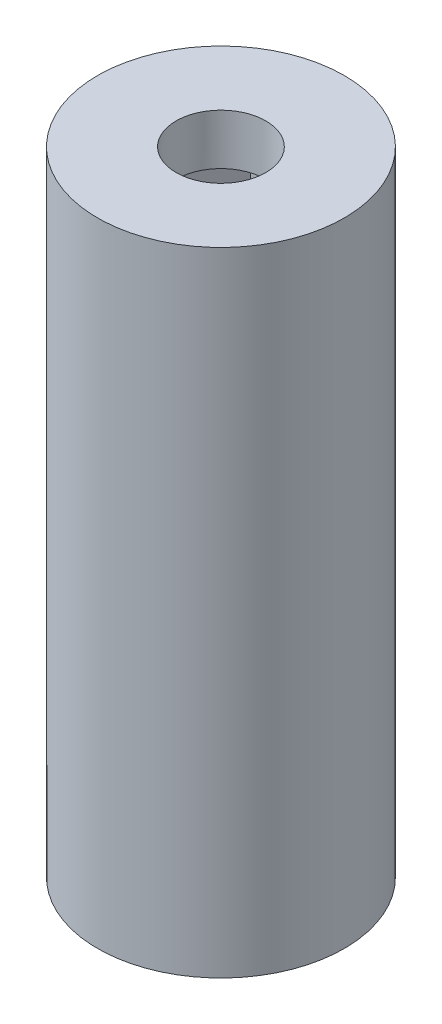
ISO-10303-21;
HEADER;
FILE_DESCRIPTION(('STEP AP214'),'2;1');
FILE_NAME('part.step','',(''),(''),'','','');
FILE_SCHEMA(('AUTOMOTIVE_DESIGN { 1 0 10303 214 1 1 1 1 }'));
ENDSEC;
DATA;
#1=APPLICATION_CONTEXT('core data for automotive mechanical design processes');
#2=APPLICATION_PROTOCOL_DEFINITION('international standard','automotive_design',2000,#1);
#3=PRODUCT_CONTEXT('',#1,'mechanical');
#4=PRODUCT('Part','Part','',(#3));
#5=PRODUCT_RELATED_PRODUCT_CATEGORY('part','',(#4));
#6=PRODUCT_DEFINITION_FORMATION('','',#4);
#7=PRODUCT_DEFINITION_CONTEXT('part definition',#1,'design');
#8=PRODUCT_DEFINITION('design','',#6,#7);
#9=PRODUCT_DEFINITION_SHAPE('','',#8);
#10=(LENGTH_UNIT() NAMED_UNIT(*) SI_UNIT(.MILLI.,.METRE.));
#11=(NAMED_UNIT(*) PLANE_ANGLE_UNIT() SI_UNIT($,.RADIAN.));
#12=(NAMED_UNIT(*) SI_UNIT($,.STERADIAN.) SOLID_ANGLE_UNIT());
#13=UNCERTAINTY_MEASURE_WITH_UNIT(LENGTH_MEASURE(1.E-05),#10,'distance_accuracy_value','');
#14=(GEOMETRIC_REPRESENTATION_CONTEXT(3) GLOBAL_UNCERTAINTY_ASSIGNED_CONTEXT((#13)) GLOBAL_UNIT_ASSIGNED_CONTEXT((#10,
#11,#12)) REPRESENTATION_CONTEXT('',''));
#15=CARTESIAN_POINT('',(0.,0.,0.));
#16=DIRECTION('',(0.,0.,1.));
#17=DIRECTION('',(1.,0.,0.));
#18=AXIS2_PLACEMENT_3D('',#15,#16,#17);
#19=CARTESIAN_POINT('',(0.,25.4,0.));
#20=DIRECTION('',(0.,1.,0.));
#21=DIRECTION('',(0.,0.,1.));
#22=AXIS2_PLACEMENT_3D('',#19,#20,#21);
#23=PLANE('',#22);
#24=CARTESIAN_POINT('',(0.,25.4,0.));
#25=DIRECTION('',(0.,1.,0.));
#26=DIRECTION('',(0.,0.,1.));
#27=AXIS2_PLACEMENT_3D('',#24,#25,#26);
#28=CIRCLE('',#27,1.8);
#29=CARTESIAN_POINT('',(0.,25.4,1.8));
#30=VERTEX_POINT('',#29);
#31=EDGE_CURVE('E142',#30,#30,#28,.T.);
#32=ORIENTED_EDGE('',*,*,#31,.F.);
#33=EDGE_LOOP('',(#32));
#34=FACE_BOUND('',#33,.T.);
#35=CARTESIAN_POINT('',(0.,25.4,0.));
#36=DIRECTION('',(0.,-1.,0.));
#37=DIRECTION('',(0.,0.,-1.));
#38=AXIS2_PLACEMENT_3D('',#35,#36,#37);
#39=CIRCLE('',#38,4.953);
#40=CARTESIAN_POINT('',(0.,25.4,-4.953));
#41=VERTEX_POINT('',#40);
#42=EDGE_CURVE('E146',#41,#41,#39,.T.);
#43=ORIENTED_EDGE('',*,*,#42,.F.);
#44=EDGE_LOOP('',(#43));
#45=FACE_BOUND('',#44,.T.);
#46=ADVANCED_FACE('F37',(#34,#45),#23,.T.);
#47=CARTESIAN_POINT('',(0.,0.,0.));
#48=DIRECTION('',(0.,-1.,0.));
#49=DIRECTION('',(0.,0.,-1.));
#50=AXIS2_PLACEMENT_3D('',#47,#48,#49);
#51=CYLINDRICAL_SURFACE('',#50,4.953);
#52=CARTESIAN_POINT('',(0.,0.,0.));
#53=DIRECTION('',(0.,-1.,0.));
#54=DIRECTION('',(0.,0.,-1.));
#55=AXIS2_PLACEMENT_3D('',#52,#53,#54);
#56=CIRCLE('',#55,4.953);
#57=CARTESIAN_POINT('',(0.,0.,-4.953));
#58=VERTEX_POINT('',#57);
#59=EDGE_CURVE('E12',#58,#58,#56,.T.);
#60=ORIENTED_EDGE('',*,*,#59,.F.);
#61=EDGE_LOOP('',(#60));
#62=FACE_BOUND('',#61,.T.);
#63=ORIENTED_EDGE('',*,*,#42,.T.);
#64=EDGE_LOOP('',(#63));
#65=FACE_BOUND('',#64,.T.);
#66=ADVANCED_FACE('F173',(#62,#65),#51,.T.);
#67=CARTESIAN_POINT('',(0.,0.,-4.953));
#68=DIRECTION('',(0.,-1.,0.));
#69=DIRECTION('',(0.,0.,-1.));
#70=AXIS2_PLACEMENT_3D('',#67,#68,#69);
#71=PLANE('',#70);
#72=DIRECTION('',(1.,0.,0.));
#73=VECTOR('',#72,1.);
#74=CARTESIAN_POINT('',(-1.6131166521158,0.,-2.794));
#75=LINE('',#74,#73);
#76=CARTESIAN_POINT('',(-1.6131166521158,0.,-2.794));
#77=VERTEX_POINT('',#76);
#78=CARTESIAN_POINT('',(1.6131166521158,0.,-2.794));
#79=VERTEX_POINT('',#78);
#80=EDGE_CURVE('E52',#77,#79,#75,.T.);
#81=ORIENTED_EDGE('',*,*,#80,.F.);
#82=DIRECTION('',(0.499999999999999,0.,-0.866025403784439));
#83=VECTOR('',#82,1.);
#84=CARTESIAN_POINT('',(-3.22623330423164,0.,0.));
#85=LINE('',#84,#83);
#86=CARTESIAN_POINT('',(-3.22623330423164,0.,0.));
#87=VERTEX_POINT('',#86);
#88=EDGE_CURVE('E125',#87,#77,#85,.T.);
#89=ORIENTED_EDGE('',*,*,#88,.F.);
#90=DIRECTION('',(-0.5,0.,-0.866025403784439));
#91=VECTOR('',#90,1.);
#92=CARTESIAN_POINT('',(-1.6131166521158,0.,2.794));
#93=LINE('',#92,#91);
#94=CARTESIAN_POINT('',(-1.6131166521158,0.,2.794));
#95=VERTEX_POINT('',#94);
#96=EDGE_CURVE('E119',#95,#87,#93,.T.);
#97=ORIENTED_EDGE('',*,*,#96,.F.);
#98=DIRECTION('',(-1.,0.,0.));
#99=VECTOR('',#98,1.);
#100=CARTESIAN_POINT('',(1.6131166521158,0.,2.794));
#101=LINE('',#100,#99);
#102=CARTESIAN_POINT('',(1.6131166521158,0.,2.794));
#103=VERTEX_POINT('',#102);
#104=EDGE_CURVE('E117',#103,#95,#101,.T.);
#105=ORIENTED_EDGE('',*,*,#104,.F.);
#106=DIRECTION('',(-0.5,0.,0.866025403784439));
#107=VECTOR('',#106,1.);
#108=CARTESIAN_POINT('',(3.22623330423164,0.,0.));
#109=LINE('',#108,#107);
#110=CARTESIAN_POINT('',(3.22623330423164,0.,0.));
#111=VERTEX_POINT('',#110);
#112=EDGE_CURVE('E102',#111,#103,#109,.T.);
#113=ORIENTED_EDGE('',*,*,#112,.F.);
#114=DIRECTION('',(0.5,0.,0.866025403784439));
#115=VECTOR('',#114,1.);
#116=CARTESIAN_POINT('',(1.6131166521158,0.,-2.794));
#117=LINE('',#116,#115);
#118=EDGE_CURVE('E109',#79,#111,#117,.T.);
#119=ORIENTED_EDGE('',*,*,#118,.F.);
#120=EDGE_LOOP('',(#81,#89,#97,#105,#113,#119));
#121=FACE_BOUND('',#120,.T.);
#122=ORIENTED_EDGE('',*,*,#59,.T.);
#123=EDGE_LOOP('',(#122));
#124=FACE_BOUND('',#123,.T.);
#125=ADVANCED_FACE('F113',(#121,#124),#71,.T.);
#126=CARTESIAN_POINT('',(-1.61311665211575,31.9038109944711,-2.794));
#127=DIRECTION('',(0.,0.,-1.));
#128=DIRECTION('',(-1.,0.,0.));
#129=AXIS2_PLACEMENT_3D('',#126,#127,#128);
#130=PLANE('',#129);
#131=DIRECTION('',(-1.,0.,0.));
#132=VECTOR('',#131,1.);
#133=CARTESIAN_POINT('',(-1.61311665211575,23.368,-2.794));
#134=LINE('',#133,#132);
#135=CARTESIAN_POINT('',(1.61311665211589,23.368,-2.794));
#136=VERTEX_POINT('',#135);
#137=CARTESIAN_POINT('',(-1.61311665211575,23.368,-2.794));
#138=VERTEX_POINT('',#137);
#139=EDGE_CURVE('E71',#136,#138,#134,.T.);
#140=ORIENTED_EDGE('',*,*,#139,.T.);
#141=DIRECTION('',(0.,-1.,0.));
#142=VECTOR('',#141,1.);
#143=CARTESIAN_POINT('',(-1.61311665211575,31.9038109944711,-2.794));
#144=LINE('',#143,#142);
#145=EDGE_CURVE('E128',#138,#77,#144,.T.);
#146=ORIENTED_EDGE('',*,*,#145,.T.);
#147=ORIENTED_EDGE('',*,*,#80,.T.);
#148=DIRECTION('',(0.,-1.,0.));
#149=VECTOR('',#148,1.);
#150=CARTESIAN_POINT('',(1.61311665211589,31.9038109944711,-2.794));
#151=LINE('',#150,#149);
#152=EDGE_CURVE('E106',#136,#79,#151,.T.);
#153=ORIENTED_EDGE('',*,*,#152,.F.);
#154=EDGE_LOOP('',(#140,#146,#147,#153));
#155=FACE_BOUND('',#154,.T.);
#156=ADVANCED_FACE('F165',(#155),#130,.F.);
#157=CARTESIAN_POINT('',(-3.22623330423155,31.9038109944711,0.));
#158=DIRECTION('',(-0.866025403784439,0.,-0.499999999999999));
#159=DIRECTION('',(-0.499999999999999,0.,0.866025403784439));
#160=AXIS2_PLACEMENT_3D('',#157,#158,#159);
#161=PLANE('',#160);
#162=DIRECTION('',(-0.499999999999999,0.,0.866025403784439));
#163=VECTOR('',#162,1.);
#164=CARTESIAN_POINT('',(-3.22623330423155,23.368,0.));
#165=LINE('',#164,#163);
#166=CARTESIAN_POINT('',(-3.22623330423155,23.368,0.));
#167=VERTEX_POINT('',#166);
#168=EDGE_CURVE('E136',#138,#167,#165,.T.);
#169=ORIENTED_EDGE('',*,*,#168,.T.);
#170=DIRECTION('',(0.,-1.,0.));
#171=VECTOR('',#170,1.);
#172=CARTESIAN_POINT('',(-3.22623330423155,31.9038109944711,0.));
#173=LINE('',#172,#171);
#174=EDGE_CURVE('E130',#167,#87,#173,.T.);
#175=ORIENTED_EDGE('',*,*,#174,.T.);
#176=ORIENTED_EDGE('',*,*,#88,.T.);
#177=ORIENTED_EDGE('',*,*,#145,.F.);
#178=EDGE_LOOP('',(#169,#175,#176,#177));
#179=FACE_BOUND('',#178,.T.);
#180=ADVANCED_FACE('F164',(#179),#161,.F.);
#181=CARTESIAN_POINT('',(-1.61311665211575,31.9038109944711,2.794));
#182=DIRECTION('',(-0.866025403784439,0.,0.5));
#183=DIRECTION('',(0.5,0.,0.866025403784439));
#184=AXIS2_PLACEMENT_3D('',#181,#182,#183);
#185=PLANE('',#184);
#186=DIRECTION('',(0.5,0.,0.866025403784439));
#187=VECTOR('',#186,1.);
#188=CARTESIAN_POINT('',(-1.61311665211575,23.368,2.794));
#189=LINE('',#188,#187);
#190=CARTESIAN_POINT('',(-1.61311665211575,23.368,2.794));
#191=VERTEX_POINT('',#190);
#192=EDGE_CURVE('E138',#167,#191,#189,.T.);
#193=ORIENTED_EDGE('',*,*,#192,.T.);
#194=DIRECTION('',(0.,-1.,0.));
#195=VECTOR('',#194,1.);
#196=CARTESIAN_POINT('',(-1.61311665211575,31.9038109944711,2.794));
#197=LINE('',#196,#195);
#198=EDGE_CURVE('E132',#191,#95,#197,.T.);
#199=ORIENTED_EDGE('',*,*,#198,.T.);
#200=ORIENTED_EDGE('',*,*,#96,.T.);
#201=ORIENTED_EDGE('',*,*,#174,.F.);
#202=EDGE_LOOP('',(#193,#199,#200,#201));
#203=FACE_BOUND('',#202,.T.);
#204=ADVANCED_FACE('F157',(#203),#185,.F.);
#205=CARTESIAN_POINT('',(1.61311665211589,31.9038109944711,2.794));
#206=DIRECTION('',(0.,0.,1.));
#207=DIRECTION('',(1.,0.,0.));
#208=AXIS2_PLACEMENT_3D('',#205,#206,#207);
#209=PLANE('',#208);
#210=DIRECTION('',(1.,0.,0.));
#211=VECTOR('',#210,1.);
#212=CARTESIAN_POINT('',(1.61311665211589,23.368,2.794));
#213=LINE('',#212,#211);
#214=CARTESIAN_POINT('',(1.61311665211589,23.368,2.794));
#215=VERTEX_POINT('',#214);
#216=EDGE_CURVE('E61',#191,#215,#213,.T.);
#217=ORIENTED_EDGE('',*,*,#216,.T.);
#218=DIRECTION('',(0.,-1.,0.));
#219=VECTOR('',#218,1.);
#220=CARTESIAN_POINT('',(1.61311665211589,31.9038109944711,2.794));
#221=LINE('',#220,#219);
#222=EDGE_CURVE('E105',#215,#103,#221,.T.);
#223=ORIENTED_EDGE('',*,*,#222,.T.);
#224=ORIENTED_EDGE('',*,*,#104,.T.);
#225=ORIENTED_EDGE('',*,*,#198,.F.);
#226=EDGE_LOOP('',(#217,#223,#224,#225));
#227=FACE_BOUND('',#226,.T.);
#228=ADVANCED_FACE('F160',(#227),#209,.F.);
#229=CARTESIAN_POINT('',(3.22623330423169,31.9038109944711,0.));
#230=DIRECTION('',(0.866025403784439,0.,0.5));
#231=DIRECTION('',(0.5,0.,-0.866025403784439));
#232=AXIS2_PLACEMENT_3D('',#229,#230,#231);
#233=PLANE('',#232);
#234=DIRECTION('',(0.5,0.,-0.866025403784439));
#235=VECTOR('',#234,1.);
#236=CARTESIAN_POINT('',(3.22623330423172,23.368,0.));
#237=LINE('',#236,#235);
#238=CARTESIAN_POINT('',(3.22623330423172,23.368,0.));
#239=VERTEX_POINT('',#238);
#240=EDGE_CURVE('E104',#215,#239,#237,.T.);
#241=ORIENTED_EDGE('',*,*,#240,.T.);
#242=DIRECTION('',(0.,-1.,0.));
#243=VECTOR('',#242,1.);
#244=CARTESIAN_POINT('',(3.22623330423169,31.9038109944711,0.));
#245=LINE('',#244,#243);
#246=EDGE_CURVE('E97',#239,#111,#245,.T.);
#247=ORIENTED_EDGE('',*,*,#246,.T.);
#248=ORIENTED_EDGE('',*,*,#112,.T.);
#249=ORIENTED_EDGE('',*,*,#222,.F.);
#250=EDGE_LOOP('',(#241,#247,#248,#249));
#251=FACE_BOUND('',#250,.T.);
#252=ADVANCED_FACE('F99',(#251),#233,.F.);
#253=CARTESIAN_POINT('',(1.61311665211589,31.9038109944711,-2.794));
#254=DIRECTION('',(0.866025403784439,0.,-0.5));
#255=DIRECTION('',(-0.5,0.,-0.866025403784439));
#256=AXIS2_PLACEMENT_3D('',#253,#254,#255);
#257=PLANE('',#256);
#258=DIRECTION('',(-0.5,0.,-0.866025403784439));
#259=VECTOR('',#258,1.);
#260=CARTESIAN_POINT('',(1.61311665211589,23.368,-2.794));
#261=LINE('',#260,#259);
#262=EDGE_CURVE('E45',#239,#136,#261,.T.);
#263=ORIENTED_EDGE('',*,*,#262,.T.);
#264=ORIENTED_EDGE('',*,*,#152,.T.);
#265=ORIENTED_EDGE('',*,*,#118,.T.);
#266=ORIENTED_EDGE('',*,*,#246,.F.);
#267=EDGE_LOOP('',(#263,#264,#265,#266));
#268=FACE_BOUND('',#267,.T.);
#269=ADVANCED_FACE('F110',(#268),#257,.F.);
#270=CARTESIAN_POINT('',(0.,23.368,-9.9441));
#271=DIRECTION('',(0.,-1.,0.));
#272=DIRECTION('',(0.,0.,-1.));
#273=AXIS2_PLACEMENT_3D('',#270,#271,#272);
#274=PLANE('',#273);
#275=CARTESIAN_POINT('',(0.,23.368,0.));
#276=DIRECTION('',(0.,-1.,0.));
#277=DIRECTION('',(0.,0.,-1.));
#278=AXIS2_PLACEMENT_3D('',#275,#276,#277);
#279=CIRCLE('',#278,1.8);
#280=CARTESIAN_POINT('',(0.,23.368,-1.8));
#281=VERTEX_POINT('',#280);
#282=EDGE_CURVE('E40',#281,#281,#279,.T.);
#283=ORIENTED_EDGE('',*,*,#282,.F.);
#284=EDGE_LOOP('',(#283));
#285=FACE_BOUND('',#284,.T.);
#286=ORIENTED_EDGE('',*,*,#139,.F.);
#287=ORIENTED_EDGE('',*,*,#262,.F.);
#288=ORIENTED_EDGE('',*,*,#240,.F.);
#289=ORIENTED_EDGE('',*,*,#216,.F.);
#290=ORIENTED_EDGE('',*,*,#192,.F.);
#291=ORIENTED_EDGE('',*,*,#168,.F.);
#292=EDGE_LOOP('',(#286,#287,#288,#289,#290,#291));
#293=FACE_BOUND('',#292,.T.);
#294=ADVANCED_FACE('F159',(#285,#293),#274,.T.);
#295=CARTESIAN_POINT('',(0.,25.4,0.));
#296=DIRECTION('',(0.,1.,0.));
#297=DIRECTION('',(0.,0.,1.));
#298=AXIS2_PLACEMENT_3D('',#295,#296,#297);
#299=CYLINDRICAL_SURFACE('',#298,1.8);
#300=ORIENTED_EDGE('',*,*,#282,.T.);
#301=EDGE_LOOP('',(#300));
#302=FACE_BOUND('',#301,.T.);
#303=ORIENTED_EDGE('',*,*,#31,.T.);
#304=EDGE_LOOP('',(#303));
#305=FACE_BOUND('',#304,.T.);
#306=ADVANCED_FACE('F231',(#302,#305),#299,.F.);
#307=CLOSED_SHELL('',(#46,#66,#125,#156,#180,#204,#228,#252,#269,#294,#306));
#308=MANIFOLD_SOLID_BREP('B2',#307);
#309=ADVANCED_BREP_SHAPE_REPRESENTATION('',(#18,#308),#14);
#310=SHAPE_DEFINITION_REPRESENTATION(#9,#309);
ENDSEC;
END-ISO-10303-21;
